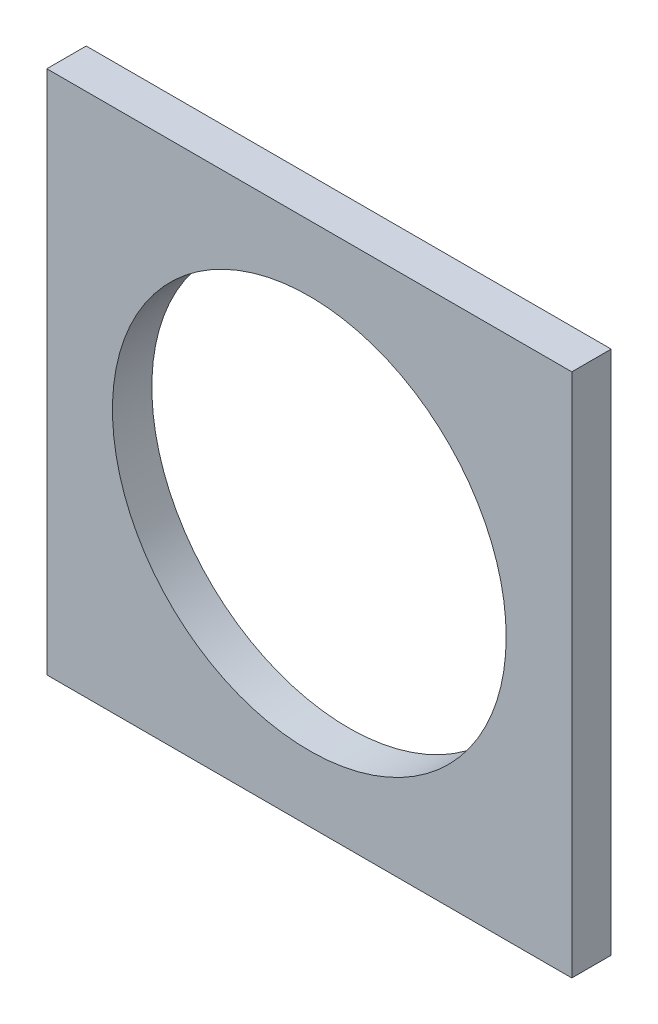
ISO-10303-21;
HEADER;
FILE_DESCRIPTION(('STEP AP214'),'2;1');
FILE_NAME('part.step','',(''),(''),'','','');
FILE_SCHEMA(('AUTOMOTIVE_DESIGN { 1 0 10303 214 1 1 1 1 }'));
ENDSEC;
DATA;
#1=APPLICATION_CONTEXT('core data for automotive mechanical design processes');
#2=APPLICATION_PROTOCOL_DEFINITION('international standard','automotive_design',2000,#1);
#3=PRODUCT_CONTEXT('',#1,'mechanical');
#4=PRODUCT('Part','Part','',(#3));
#5=PRODUCT_RELATED_PRODUCT_CATEGORY('part','',(#4));
#6=PRODUCT_DEFINITION_FORMATION('','',#4);
#7=PRODUCT_DEFINITION_CONTEXT('part definition',#1,'design');
#8=PRODUCT_DEFINITION('design','',#6,#7);
#9=PRODUCT_DEFINITION_SHAPE('','',#8);
#10=(LENGTH_UNIT() NAMED_UNIT(*) SI_UNIT(.MILLI.,.METRE.));
#11=(NAMED_UNIT(*) PLANE_ANGLE_UNIT() SI_UNIT($,.RADIAN.));
#12=(NAMED_UNIT(*) SI_UNIT($,.STERADIAN.) SOLID_ANGLE_UNIT());
#13=UNCERTAINTY_MEASURE_WITH_UNIT(LENGTH_MEASURE(1.E-05),#10,'distance_accuracy_value','');
#14=(GEOMETRIC_REPRESENTATION_CONTEXT(3) GLOBAL_UNCERTAINTY_ASSIGNED_CONTEXT((#13)) GLOBAL_UNIT_ASSIGNED_CONTEXT((#10,
#11,#12)) REPRESENTATION_CONTEXT('',''));
#15=CARTESIAN_POINT('',(0.,0.,0.));
#16=DIRECTION('',(0.,0.,1.));
#17=DIRECTION('',(1.,0.,0.));
#18=AXIS2_PLACEMENT_3D('',#15,#16,#17);
#19=CARTESIAN_POINT('',(0.,0.,3.));
#20=DIRECTION('',(0.,0.,1.));
#21=DIRECTION('',(1.,0.,0.));
#22=AXIS2_PLACEMENT_3D('',#19,#20,#21);
#23=PLANE('',#22);
#24=DIRECTION('',(0.,-1.,0.));
#25=VECTOR('',#24,1.);
#26=CARTESIAN_POINT('',(-75.,-103.411017403315,3.));
#27=LINE('',#26,#25);
#28=CARTESIAN_POINT('',(-75.,-103.411017403315,3.));
#29=VERTEX_POINT('',#28);
#30=CARTESIAN_POINT('',(-75.,-143.411017403315,3.));
#31=VERTEX_POINT('',#30);
#32=EDGE_CURVE('E91',#29,#31,#27,.T.);
#33=ORIENTED_EDGE('',*,*,#32,.T.);
#34=DIRECTION('',(1.,0.,0.));
#35=VECTOR('',#34,1.);
#36=CARTESIAN_POINT('',(-75.,-143.411017403315,3.));
#37=LINE('',#36,#35);
#38=CARTESIAN_POINT('',(-35.,-143.411017403315,3.));
#39=VERTEX_POINT('',#38);
#40=EDGE_CURVE('E86',#31,#39,#37,.T.);
#41=ORIENTED_EDGE('',*,*,#40,.T.);
#42=DIRECTION('',(0.,1.,0.));
#43=VECTOR('',#42,1.);
#44=CARTESIAN_POINT('',(-35.,-103.411017403315,3.));
#45=LINE('',#44,#43);
#46=CARTESIAN_POINT('',(-35.,-103.411017403315,3.));
#47=VERTEX_POINT('',#46);
#48=EDGE_CURVE('E89',#39,#47,#45,.T.);
#49=ORIENTED_EDGE('',*,*,#48,.T.);
#50=DIRECTION('',(-1.,0.,0.));
#51=VECTOR('',#50,1.);
#52=CARTESIAN_POINT('',(-75.,-103.411017403315,3.));
#53=LINE('',#52,#51);
#54=EDGE_CURVE('E56',#47,#29,#53,.T.);
#55=ORIENTED_EDGE('',*,*,#54,.T.);
#56=EDGE_LOOP('',(#33,#41,#49,#55));
#57=FACE_BOUND('',#56,.T.);
#58=CARTESIAN_POINT('',(-55.,-123.411017403315,3.));
#59=DIRECTION('',(0.,0.,1.));
#60=DIRECTION('',(1.,0.,0.));
#61=AXIS2_PLACEMENT_3D('',#58,#59,#60);
#62=CIRCLE('',#61,15.);
#63=CARTESIAN_POINT('',(-40.,-123.411017403315,3.));
#64=VERTEX_POINT('',#63);
#65=EDGE_CURVE('E106',#64,#64,#62,.T.);
#66=ORIENTED_EDGE('',*,*,#65,.F.);
#67=EDGE_LOOP('',(#66));
#68=FACE_BOUND('',#67,.T.);
#69=ADVANCED_FACE('F39',(#57,#68),#23,.T.);
#70=CARTESIAN_POINT('',(0.,0.,0.));
#71=DIRECTION('',(0.,0.,1.));
#72=DIRECTION('',(1.,0.,0.));
#73=AXIS2_PLACEMENT_3D('',#70,#71,#72);
#74=PLANE('',#73);
#75=DIRECTION('',(0.,-1.,0.));
#76=VECTOR('',#75,1.);
#77=CARTESIAN_POINT('',(-75.,-103.411017403315,0.));
#78=LINE('',#77,#76);
#79=CARTESIAN_POINT('',(-75.,-103.411017403315,0.));
#80=VERTEX_POINT('',#79);
#81=CARTESIAN_POINT('',(-75.,-143.411017403315,0.));
#82=VERTEX_POINT('',#81);
#83=EDGE_CURVE('E103',#80,#82,#78,.T.);
#84=ORIENTED_EDGE('',*,*,#83,.F.);
#85=DIRECTION('',(-1.,0.,0.));
#86=VECTOR('',#85,1.);
#87=CARTESIAN_POINT('',(-75.,-103.411017403315,0.));
#88=LINE('',#87,#86);
#89=CARTESIAN_POINT('',(-35.,-103.411017403315,0.));
#90=VERTEX_POINT('',#89);
#91=EDGE_CURVE('E79',#90,#80,#88,.T.);
#92=ORIENTED_EDGE('',*,*,#91,.F.);
#93=DIRECTION('',(0.,1.,0.));
#94=VECTOR('',#93,1.);
#95=CARTESIAN_POINT('',(-35.,-103.411017403315,0.));
#96=LINE('',#95,#94);
#97=CARTESIAN_POINT('',(-35.,-143.411017403315,0.));
#98=VERTEX_POINT('',#97);
#99=EDGE_CURVE('E73',#98,#90,#96,.T.);
#100=ORIENTED_EDGE('',*,*,#99,.F.);
#101=DIRECTION('',(1.,0.,0.));
#102=VECTOR('',#101,1.);
#103=CARTESIAN_POINT('',(-75.,-143.411017403315,0.));
#104=LINE('',#103,#102);
#105=EDGE_CURVE('E95',#82,#98,#104,.T.);
#106=ORIENTED_EDGE('',*,*,#105,.F.);
#107=EDGE_LOOP('',(#84,#92,#100,#106));
#108=FACE_BOUND('',#107,.T.);
#109=CARTESIAN_POINT('',(-55.,-123.411017403315,0.));
#110=DIRECTION('',(0.,0.,1.));
#111=DIRECTION('',(1.,0.,0.));
#112=AXIS2_PLACEMENT_3D('',#109,#110,#111);
#113=CIRCLE('',#112,15.);
#114=CARTESIAN_POINT('',(-40.,-123.411017403315,0.));
#115=VERTEX_POINT('',#114);
#116=EDGE_CURVE('E118',#115,#115,#113,.T.);
#117=ORIENTED_EDGE('',*,*,#116,.T.);
#118=EDGE_LOOP('',(#117));
#119=FACE_BOUND('',#118,.T.);
#120=ADVANCED_FACE('F114',(#108,#119),#74,.F.);
#121=CARTESIAN_POINT('',(-75.,-103.411017403315,3.));
#122=DIRECTION('',(1.,0.,0.));
#123=DIRECTION('',(0.,0.,-1.));
#124=AXIS2_PLACEMENT_3D('',#121,#122,#123);
#125=PLANE('',#124);
#126=ORIENTED_EDGE('',*,*,#83,.T.);
#127=DIRECTION('',(0.,0.,-1.));
#128=VECTOR('',#127,1.);
#129=CARTESIAN_POINT('',(-75.,-143.411017403315,3.));
#130=LINE('',#129,#128);
#131=EDGE_CURVE('E11',#31,#82,#130,.T.);
#132=ORIENTED_EDGE('',*,*,#131,.F.);
#133=ORIENTED_EDGE('',*,*,#32,.F.);
#134=DIRECTION('',(0.,0.,-1.));
#135=VECTOR('',#134,1.);
#136=CARTESIAN_POINT('',(-75.,-103.411017403315,3.));
#137=LINE('',#136,#135);
#138=EDGE_CURVE('E99',#29,#80,#137,.T.);
#139=ORIENTED_EDGE('',*,*,#138,.T.);
#140=EDGE_LOOP('',(#126,#132,#133,#139));
#141=FACE_BOUND('',#140,.T.);
#142=ADVANCED_FACE('F41',(#141),#125,.F.);
#143=CARTESIAN_POINT('',(-75.,-143.411017403315,3.));
#144=DIRECTION('',(0.,1.,0.));
#145=DIRECTION('',(0.,0.,1.));
#146=AXIS2_PLACEMENT_3D('',#143,#144,#145);
#147=PLANE('',#146);
#148=ORIENTED_EDGE('',*,*,#105,.T.);
#149=DIRECTION('',(0.,0.,-1.));
#150=VECTOR('',#149,1.);
#151=CARTESIAN_POINT('',(-35.,-143.411017403315,3.));
#152=LINE('',#151,#150);
#153=EDGE_CURVE('E48',#39,#98,#152,.T.);
#154=ORIENTED_EDGE('',*,*,#153,.F.);
#155=ORIENTED_EDGE('',*,*,#40,.F.);
#156=ORIENTED_EDGE('',*,*,#131,.T.);
#157=EDGE_LOOP('',(#148,#154,#155,#156));
#158=FACE_BOUND('',#157,.T.);
#159=ADVANCED_FACE('F94',(#158),#147,.F.);
#160=CARTESIAN_POINT('',(-35.,-103.411017403315,3.));
#161=DIRECTION('',(-1.,0.,0.));
#162=DIRECTION('',(0.,-1.,0.));
#163=AXIS2_PLACEMENT_3D('',#160,#161,#162);
#164=PLANE('',#163);
#165=ORIENTED_EDGE('',*,*,#99,.T.);
#166=DIRECTION('',(0.,0.,-1.));
#167=VECTOR('',#166,1.);
#168=CARTESIAN_POINT('',(-35.,-103.411017403315,3.));
#169=LINE('',#168,#167);
#170=EDGE_CURVE('E96',#47,#90,#169,.T.);
#171=ORIENTED_EDGE('',*,*,#170,.F.);
#172=ORIENTED_EDGE('',*,*,#48,.F.);
#173=ORIENTED_EDGE('',*,*,#153,.T.);
#174=EDGE_LOOP('',(#165,#171,#172,#173));
#175=FACE_BOUND('',#174,.T.);
#176=ADVANCED_FACE('F97',(#175),#164,.F.);
#177=CARTESIAN_POINT('',(-75.,-103.411017403315,3.));
#178=DIRECTION('',(0.,-1.,0.));
#179=DIRECTION('',(0.,0.,-1.));
#180=AXIS2_PLACEMENT_3D('',#177,#178,#179);
#181=PLANE('',#180);
#182=ORIENTED_EDGE('',*,*,#91,.T.);
#183=ORIENTED_EDGE('',*,*,#138,.F.);
#184=ORIENTED_EDGE('',*,*,#54,.F.);
#185=ORIENTED_EDGE('',*,*,#170,.T.);
#186=EDGE_LOOP('',(#182,#183,#184,#185));
#187=FACE_BOUND('',#186,.T.);
#188=ADVANCED_FACE('F111',(#187),#181,.F.);
#189=CARTESIAN_POINT('',(-55.,-123.411017403315,3.));
#190=DIRECTION('',(0.,0.,-1.));
#191=DIRECTION('',(-1.,0.,0.));
#192=AXIS2_PLACEMENT_3D('',#189,#190,#191);
#193=CYLINDRICAL_SURFACE('',#192,15.);
#194=ORIENTED_EDGE('',*,*,#65,.T.);
#195=EDGE_LOOP('',(#194));
#196=FACE_BOUND('',#195,.T.);
#197=ORIENTED_EDGE('',*,*,#116,.F.);
#198=EDGE_LOOP('',(#197));
#199=FACE_BOUND('',#198,.T.);
#200=ADVANCED_FACE('F124',(#196,#199),#193,.F.);
#201=CLOSED_SHELL('',(#69,#120,#142,#159,#176,#188,#200));
#202=MANIFOLD_SOLID_BREP('B2',#201);
#203=ADVANCED_BREP_SHAPE_REPRESENTATION('',(#18,#202),#14);
#204=SHAPE_DEFINITION_REPRESENTATION(#9,#203);
ENDSEC;
END-ISO-10303-21;
